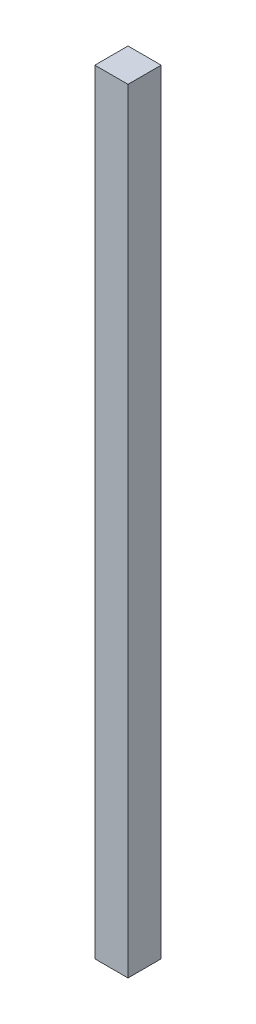
ISO-10303-21;
HEADER;
FILE_DESCRIPTION(('STEP AP214'),'2;1');
FILE_NAME('part.step','',(''),(''),'','','');
FILE_SCHEMA(('AUTOMOTIVE_DESIGN { 1 0 10303 214 1 1 1 1 }'));
ENDSEC;
DATA;
#1=APPLICATION_CONTEXT('core data for automotive mechanical design processes');
#2=APPLICATION_PROTOCOL_DEFINITION('international standard','automotive_design',2000,#1);
#3=PRODUCT_CONTEXT('',#1,'mechanical');
#4=PRODUCT('Part','Part','',(#3));
#5=PRODUCT_RELATED_PRODUCT_CATEGORY('part','',(#4));
#6=PRODUCT_DEFINITION_FORMATION('','',#4);
#7=PRODUCT_DEFINITION_CONTEXT('part definition',#1,'design');
#8=PRODUCT_DEFINITION('design','',#6,#7);
#9=PRODUCT_DEFINITION_SHAPE('','',#8);
#10=(LENGTH_UNIT() NAMED_UNIT(*) SI_UNIT(.MILLI.,.METRE.));
#11=(NAMED_UNIT(*) PLANE_ANGLE_UNIT() SI_UNIT($,.RADIAN.));
#12=(NAMED_UNIT(*) SI_UNIT($,.STERADIAN.) SOLID_ANGLE_UNIT());
#13=UNCERTAINTY_MEASURE_WITH_UNIT(LENGTH_MEASURE(1.E-05),#10,'distance_accuracy_value','');
#14=(GEOMETRIC_REPRESENTATION_CONTEXT(3) GLOBAL_UNCERTAINTY_ASSIGNED_CONTEXT((#13)) GLOBAL_UNIT_ASSIGNED_CONTEXT((#10,
#11,#12)) REPRESENTATION_CONTEXT('',''));
#15=CARTESIAN_POINT('',(0.,0.,0.));
#16=DIRECTION('',(0.,0.,1.));
#17=DIRECTION('',(1.,0.,0.));
#18=AXIS2_PLACEMENT_3D('',#15,#16,#17);
#19=CARTESIAN_POINT('',(0.,889.,0.));
#20=DIRECTION('',(1.,0.,0.));
#21=DIRECTION('',(0.,0.,-1.));
#22=AXIS2_PLACEMENT_3D('',#19,#20,#21);
#23=PLANE('',#22);
#24=DIRECTION('',(0.,0.,1.));
#25=VECTOR('',#24,1.);
#26=CARTESIAN_POINT('',(0.,0.,0.));
#27=LINE('',#26,#25);
#28=CARTESIAN_POINT('',(0.,0.,0.));
#29=VERTEX_POINT('',#28);
#30=CARTESIAN_POINT('',(0.,0.,38.1));
#31=VERTEX_POINT('',#30);
#32=EDGE_CURVE('E111',#29,#31,#27,.T.);
#33=ORIENTED_EDGE('',*,*,#32,.T.);
#34=DIRECTION('',(0.,-1.,0.));
#35=VECTOR('',#34,1.);
#36=CARTESIAN_POINT('',(0.,889.,38.1));
#37=LINE('',#36,#35);
#38=CARTESIAN_POINT('',(0.,889.,38.1));
#39=VERTEX_POINT('',#38);
#40=EDGE_CURVE('E11',#39,#31,#37,.T.);
#41=ORIENTED_EDGE('',*,*,#40,.F.);
#42=DIRECTION('',(0.,0.,1.));
#43=VECTOR('',#42,1.);
#44=CARTESIAN_POINT('',(0.,889.,0.));
#45=LINE('',#44,#43);
#46=CARTESIAN_POINT('',(0.,889.,0.));
#47=VERTEX_POINT('',#46);
#48=EDGE_CURVE('E95',#47,#39,#45,.T.);
#49=ORIENTED_EDGE('',*,*,#48,.F.);
#50=DIRECTION('',(0.,-1.,0.));
#51=VECTOR('',#50,1.);
#52=CARTESIAN_POINT('',(0.,889.,0.));
#53=LINE('',#52,#51);
#54=EDGE_CURVE('E107',#47,#29,#53,.T.);
#55=ORIENTED_EDGE('',*,*,#54,.T.);
#56=EDGE_LOOP('',(#33,#41,#49,#55));
#57=FACE_BOUND('',#56,.T.);
#58=ADVANCED_FACE('F43',(#57),#23,.F.);
#59=CARTESIAN_POINT('',(0.,889.,38.1));
#60=DIRECTION('',(0.,0.,-1.));
#61=DIRECTION('',(-1.,0.,0.));
#62=AXIS2_PLACEMENT_3D('',#59,#60,#61);
#63=PLANE('',#62);
#64=DIRECTION('',(1.,0.,0.));
#65=VECTOR('',#64,1.);
#66=CARTESIAN_POINT('',(0.,0.,38.1));
#67=LINE('',#66,#65);
#68=CARTESIAN_POINT('',(38.1,0.,38.1));
#69=VERTEX_POINT('',#68);
#70=EDGE_CURVE('E100',#31,#69,#67,.T.);
#71=ORIENTED_EDGE('',*,*,#70,.T.);
#72=DIRECTION('',(0.,-1.,0.));
#73=VECTOR('',#72,1.);
#74=CARTESIAN_POINT('',(38.1,889.,38.1));
#75=LINE('',#74,#73);
#76=CARTESIAN_POINT('',(38.1,889.,38.1));
#77=VERTEX_POINT('',#76);
#78=EDGE_CURVE('E52',#77,#69,#75,.T.);
#79=ORIENTED_EDGE('',*,*,#78,.F.);
#80=DIRECTION('',(1.,0.,0.));
#81=VECTOR('',#80,1.);
#82=CARTESIAN_POINT('',(0.,889.,38.1));
#83=LINE('',#82,#81);
#84=EDGE_CURVE('E90',#39,#77,#83,.T.);
#85=ORIENTED_EDGE('',*,*,#84,.F.);
#86=ORIENTED_EDGE('',*,*,#40,.T.);
#87=EDGE_LOOP('',(#71,#79,#85,#86));
#88=FACE_BOUND('',#87,.T.);
#89=ADVANCED_FACE('F99',(#88),#63,.F.);
#90=CARTESIAN_POINT('',(38.1,889.,0.));
#91=DIRECTION('',(-1.,0.,0.));
#92=DIRECTION('',(0.,0.,1.));
#93=AXIS2_PLACEMENT_3D('',#90,#91,#92);
#94=PLANE('',#93);
#95=DIRECTION('',(0.,0.,-1.));
#96=VECTOR('',#95,1.);
#97=CARTESIAN_POINT('',(38.1,0.,0.));
#98=LINE('',#97,#96);
#99=CARTESIAN_POINT('',(38.1,0.,0.));
#100=VERTEX_POINT('',#99);
#101=EDGE_CURVE('E77',#69,#100,#98,.T.);
#102=ORIENTED_EDGE('',*,*,#101,.T.);
#103=DIRECTION('',(0.,-1.,0.));
#104=VECTOR('',#103,1.);
#105=CARTESIAN_POINT('',(38.1,889.,0.));
#106=LINE('',#105,#104);
#107=CARTESIAN_POINT('',(38.1,889.,0.));
#108=VERTEX_POINT('',#107);
#109=EDGE_CURVE('E102',#108,#100,#106,.T.);
#110=ORIENTED_EDGE('',*,*,#109,.F.);
#111=DIRECTION('',(0.,0.,-1.));
#112=VECTOR('',#111,1.);
#113=CARTESIAN_POINT('',(38.1,889.,0.));
#114=LINE('',#113,#112);
#115=EDGE_CURVE('E93',#77,#108,#114,.T.);
#116=ORIENTED_EDGE('',*,*,#115,.F.);
#117=ORIENTED_EDGE('',*,*,#78,.T.);
#118=EDGE_LOOP('',(#102,#110,#116,#117));
#119=FACE_BOUND('',#118,.T.);
#120=ADVANCED_FACE('F103',(#119),#94,.F.);
#121=CARTESIAN_POINT('',(0.,889.,0.));
#122=DIRECTION('',(0.,0.,1.));
#123=DIRECTION('',(1.,0.,0.));
#124=AXIS2_PLACEMENT_3D('',#121,#122,#123);
#125=PLANE('',#124);
#126=DIRECTION('',(-1.,0.,0.));
#127=VECTOR('',#126,1.);
#128=CARTESIAN_POINT('',(0.,0.,0.));
#129=LINE('',#128,#127);
#130=EDGE_CURVE('E83',#100,#29,#129,.T.);
#131=ORIENTED_EDGE('',*,*,#130,.T.);
#132=ORIENTED_EDGE('',*,*,#54,.F.);
#133=DIRECTION('',(-1.,0.,0.));
#134=VECTOR('',#133,1.);
#135=CARTESIAN_POINT('',(0.,889.,0.));
#136=LINE('',#135,#134);
#137=EDGE_CURVE('E60',#108,#47,#136,.T.);
#138=ORIENTED_EDGE('',*,*,#137,.F.);
#139=ORIENTED_EDGE('',*,*,#109,.T.);
#140=EDGE_LOOP('',(#131,#132,#138,#139));
#141=FACE_BOUND('',#140,.T.);
#142=ADVANCED_FACE('F124',(#141),#125,.F.);
#143=CARTESIAN_POINT('',(0.,889.,0.));
#144=DIRECTION('',(0.,1.,0.));
#145=DIRECTION('',(0.,0.,1.));
#146=AXIS2_PLACEMENT_3D('',#143,#144,#145);
#147=PLANE('',#146);
#148=ORIENTED_EDGE('',*,*,#48,.T.);
#149=ORIENTED_EDGE('',*,*,#84,.T.);
#150=ORIENTED_EDGE('',*,*,#115,.T.);
#151=ORIENTED_EDGE('',*,*,#137,.T.);
#152=EDGE_LOOP('',(#148,#149,#150,#151));
#153=FACE_BOUND('',#152,.T.);
#154=ADVANCED_FACE('F91',(#153),#147,.T.);
#155=CARTESIAN_POINT('',(0.,0.,0.));
#156=DIRECTION('',(0.,1.,0.));
#157=DIRECTION('',(0.,0.,1.));
#158=AXIS2_PLACEMENT_3D('',#155,#156,#157);
#159=PLANE('',#158);
#160=ORIENTED_EDGE('',*,*,#32,.F.);
#161=ORIENTED_EDGE('',*,*,#130,.F.);
#162=ORIENTED_EDGE('',*,*,#101,.F.);
#163=ORIENTED_EDGE('',*,*,#70,.F.);
#164=EDGE_LOOP('',(#160,#161,#162,#163));
#165=FACE_BOUND('',#164,.T.);
#166=ADVANCED_FACE('F127',(#165),#159,.F.);
#167=CLOSED_SHELL('',(#58,#89,#120,#142,#154,#166));
#168=MANIFOLD_SOLID_BREP('B2',#167);
#169=ADVANCED_BREP_SHAPE_REPRESENTATION('',(#18,#168),#14);
#170=SHAPE_DEFINITION_REPRESENTATION(#9,#169);
ENDSEC;
END-ISO-10303-21;
